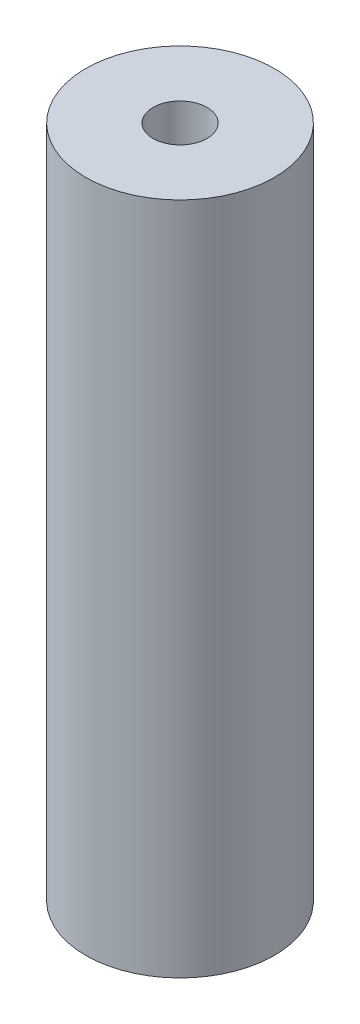
ISO-10303-21;
HEADER;
FILE_DESCRIPTION(('STEP AP214'),'2;1');
FILE_NAME('part.step','',(''),(''),'','','');
FILE_SCHEMA(('AUTOMOTIVE_DESIGN { 1 0 10303 214 1 1 1 1 }'));
ENDSEC;
DATA;
#1=APPLICATION_CONTEXT('core data for automotive mechanical design processes');
#2=APPLICATION_PROTOCOL_DEFINITION('international standard','automotive_design',2000,#1);
#3=PRODUCT_CONTEXT('',#1,'mechanical');
#4=PRODUCT('Part','Part','',(#3));
#5=PRODUCT_RELATED_PRODUCT_CATEGORY('part','',(#4));
#6=PRODUCT_DEFINITION_FORMATION('','',#4);
#7=PRODUCT_DEFINITION_CONTEXT('part definition',#1,'design');
#8=PRODUCT_DEFINITION('design','',#6,#7);
#9=PRODUCT_DEFINITION_SHAPE('','',#8);
#10=(LENGTH_UNIT() NAMED_UNIT(*) SI_UNIT(.MILLI.,.METRE.));
#11=(NAMED_UNIT(*) PLANE_ANGLE_UNIT() SI_UNIT($,.RADIAN.));
#12=(NAMED_UNIT(*) SI_UNIT($,.STERADIAN.) SOLID_ANGLE_UNIT());
#13=UNCERTAINTY_MEASURE_WITH_UNIT(LENGTH_MEASURE(1.E-05),#10,'distance_accuracy_value','');
#14=(GEOMETRIC_REPRESENTATION_CONTEXT(3) GLOBAL_UNCERTAINTY_ASSIGNED_CONTEXT((#13)) GLOBAL_UNIT_ASSIGNED_CONTEXT((#10,
#11,#12)) REPRESENTATION_CONTEXT('',''));
#15=CARTESIAN_POINT('',(0.,0.,0.));
#16=DIRECTION('',(0.,0.,1.));
#17=DIRECTION('',(1.,0.,0.));
#18=AXIS2_PLACEMENT_3D('',#15,#16,#17);
#19=CARTESIAN_POINT('',(0.,50.,0.));
#20=DIRECTION('',(0.,1.,0.));
#21=DIRECTION('',(0.,0.,1.));
#22=AXIS2_PLACEMENT_3D('',#19,#20,#21);
#23=PLANE('',#22);
#24=CARTESIAN_POINT('',(0.,50.,0.));
#25=DIRECTION('',(0.,1.,0.));
#26=DIRECTION('',(0.,0.,1.));
#27=AXIS2_PLACEMENT_3D('',#24,#25,#26);
#28=CIRCLE('',#27,7.);
#29=CARTESIAN_POINT('',(0.,50.,7.));
#30=VERTEX_POINT('',#29);
#31=EDGE_CURVE('E10',#30,#30,#28,.T.);
#32=ORIENTED_EDGE('',*,*,#31,.T.);
#33=EDGE_LOOP('',(#32));
#34=FACE_BOUND('',#33,.T.);
#35=CARTESIAN_POINT('',(0.,50.,0.));
#36=DIRECTION('',(0.,1.,0.));
#37=DIRECTION('',(0.,0.,1.));
#38=AXIS2_PLACEMENT_3D('',#35,#36,#37);
#39=CIRCLE('',#38,2.);
#40=CARTESIAN_POINT('',(0.,50.,2.));
#41=VERTEX_POINT('',#40);
#42=EDGE_CURVE('E42',#41,#41,#39,.T.);
#43=ORIENTED_EDGE('',*,*,#42,.F.);
#44=EDGE_LOOP('',(#43));
#45=FACE_BOUND('',#44,.T.);
#46=ADVANCED_FACE('F31',(#34,#45),#23,.T.);
#47=CARTESIAN_POINT('',(0.,0.,0.));
#48=DIRECTION('',(0.,1.,0.));
#49=DIRECTION('',(0.,0.,1.));
#50=AXIS2_PLACEMENT_3D('',#47,#48,#49);
#51=PLANE('',#50);
#52=CARTESIAN_POINT('',(0.,0.,0.));
#53=DIRECTION('',(0.,1.,0.));
#54=DIRECTION('',(0.,0.,1.));
#55=AXIS2_PLACEMENT_3D('',#52,#53,#54);
#56=CIRCLE('',#55,7.);
#57=CARTESIAN_POINT('',(0.,0.,7.));
#58=VERTEX_POINT('',#57);
#59=EDGE_CURVE('E35',#58,#58,#56,.T.);
#60=ORIENTED_EDGE('',*,*,#59,.F.);
#61=EDGE_LOOP('',(#60));
#62=FACE_BOUND('',#61,.T.);
#63=CARTESIAN_POINT('',(0.,0.,0.));
#64=DIRECTION('',(0.,1.,0.));
#65=DIRECTION('',(0.,0.,1.));
#66=AXIS2_PLACEMENT_3D('',#63,#64,#65);
#67=CIRCLE('',#66,2.);
#68=CARTESIAN_POINT('',(0.,0.,2.));
#69=VERTEX_POINT('',#68);
#70=EDGE_CURVE('E44',#69,#69,#67,.T.);
#71=ORIENTED_EDGE('',*,*,#70,.T.);
#72=EDGE_LOOP('',(#71));
#73=FACE_BOUND('',#72,.T.);
#74=ADVANCED_FACE('F54',(#62,#73),#51,.F.);
#75=CARTESIAN_POINT('',(0.,50.,0.));
#76=DIRECTION('',(0.,-1.,0.));
#77=DIRECTION('',(0.,0.,-1.));
#78=AXIS2_PLACEMENT_3D('',#75,#76,#77);
#79=CYLINDRICAL_SURFACE('',#78,7.);
#80=ORIENTED_EDGE('',*,*,#31,.F.);
#81=EDGE_LOOP('',(#80));
#82=FACE_BOUND('',#81,.T.);
#83=ORIENTED_EDGE('',*,*,#59,.T.);
#84=EDGE_LOOP('',(#83));
#85=FACE_BOUND('',#84,.T.);
#86=ADVANCED_FACE('F33',(#82,#85),#79,.T.);
#87=CARTESIAN_POINT('',(0.,50.,0.));
#88=DIRECTION('',(0.,-1.,0.));
#89=DIRECTION('',(0.,0.,-1.));
#90=AXIS2_PLACEMENT_3D('',#87,#88,#89);
#91=CYLINDRICAL_SURFACE('',#90,2.);
#92=ORIENTED_EDGE('',*,*,#42,.T.);
#93=EDGE_LOOP('',(#92));
#94=FACE_BOUND('',#93,.T.);
#95=ORIENTED_EDGE('',*,*,#70,.F.);
#96=EDGE_LOOP('',(#95));
#97=FACE_BOUND('',#96,.T.);
#98=ADVANCED_FACE('F50',(#94,#97),#91,.F.);
#99=CLOSED_SHELL('',(#46,#74,#86,#98));
#100=MANIFOLD_SOLID_BREP('B2',#99);
#101=ADVANCED_BREP_SHAPE_REPRESENTATION('',(#18,#100),#14);
#102=SHAPE_DEFINITION_REPRESENTATION(#9,#101);
ENDSEC;
END-ISO-10303-21;
